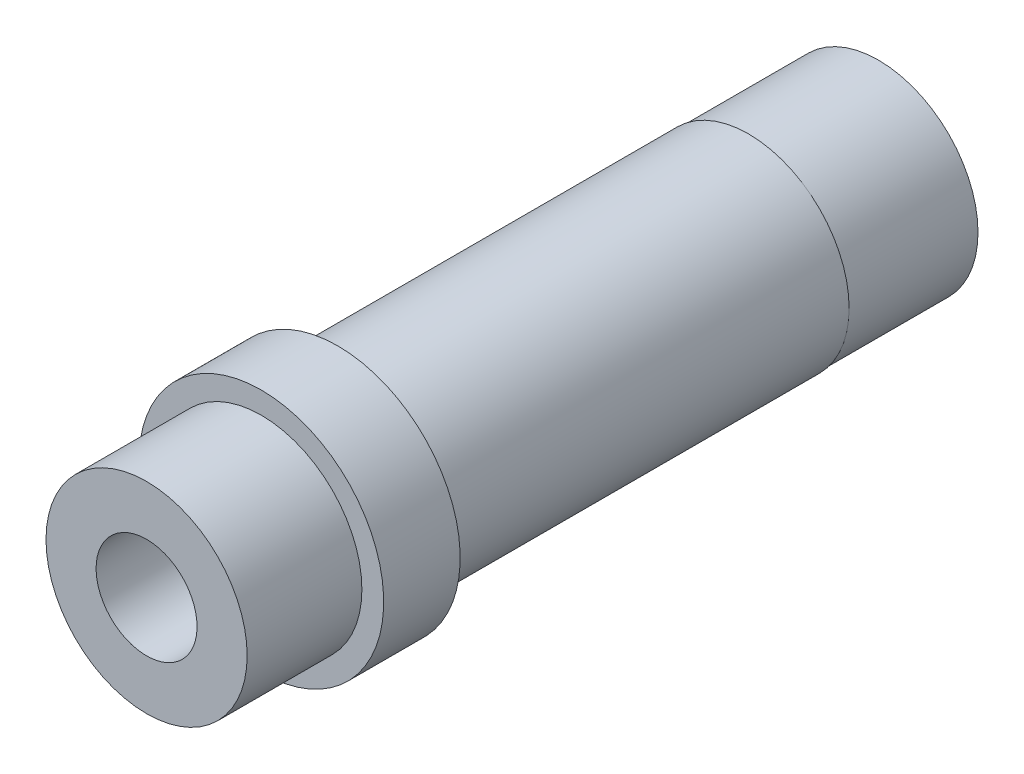
ISO-10303-21;
HEADER;
FILE_DESCRIPTION(('STEP AP214'),'2;1');
FILE_NAME('part.step','',(''),(''),'','','');
FILE_SCHEMA(('AUTOMOTIVE_DESIGN { 1 0 10303 214 1 1 1 1 }'));
ENDSEC;
DATA;
#1=APPLICATION_CONTEXT('core data for automotive mechanical design processes');
#2=APPLICATION_PROTOCOL_DEFINITION('international standard','automotive_design',2000,#1);
#3=PRODUCT_CONTEXT('',#1,'mechanical');
#4=PRODUCT('Part','Part','',(#3));
#5=PRODUCT_RELATED_PRODUCT_CATEGORY('part','',(#4));
#6=PRODUCT_DEFINITION_FORMATION('','',#4);
#7=PRODUCT_DEFINITION_CONTEXT('part definition',#1,'design');
#8=PRODUCT_DEFINITION('design','',#6,#7);
#9=PRODUCT_DEFINITION_SHAPE('','',#8);
#10=(LENGTH_UNIT() NAMED_UNIT(*) SI_UNIT(.MILLI.,.METRE.));
#11=(NAMED_UNIT(*) PLANE_ANGLE_UNIT() SI_UNIT($,.RADIAN.));
#12=(NAMED_UNIT(*) SI_UNIT($,.STERADIAN.) SOLID_ANGLE_UNIT());
#13=UNCERTAINTY_MEASURE_WITH_UNIT(LENGTH_MEASURE(1.E-05),#10,'distance_accuracy_value','');
#14=(GEOMETRIC_REPRESENTATION_CONTEXT(3) GLOBAL_UNCERTAINTY_ASSIGNED_CONTEXT((#13)) GLOBAL_UNIT_ASSIGNED_CONTEXT((#10,
#11,#12)) REPRESENTATION_CONTEXT('',''));
#15=CARTESIAN_POINT('',(0.,0.,0.));
#16=DIRECTION('',(0.,0.,1.));
#17=DIRECTION('',(1.,0.,0.));
#18=AXIS2_PLACEMENT_3D('',#15,#16,#17);
#19=CARTESIAN_POINT('',(0.,160.,0.));
#20=DIRECTION('',(0.,0.,-1.));
#21=DIRECTION('',(0.,1.,0.));
#22=AXIS2_PLACEMENT_3D('',#19,#20,#21);
#23=PLANE('',#22);
#24=CARTESIAN_POINT('',(0.,0.,0.));
#25=DIRECTION('',(0.,0.,1.));
#26=DIRECTION('',(0.,-1.,0.));
#27=AXIS2_PLACEMENT_3D('',#24,#25,#26);
#28=CIRCLE('',#27,131.5);
#29=CARTESIAN_POINT('',(0.,-131.5,0.));
#30=VERTEX_POINT('',#29);
#31=EDGE_CURVE('E72',#30,#30,#28,.T.);
#32=ORIENTED_EDGE('',*,*,#31,.F.);
#33=EDGE_LOOP('',(#32));
#34=FACE_BOUND('',#33,.T.);
#35=CARTESIAN_POINT('',(0.,0.,0.));
#36=DIRECTION('',(0.,0.,1.));
#37=DIRECTION('',(0.,-1.,0.));
#38=AXIS2_PLACEMENT_3D('',#35,#36,#37);
#39=CIRCLE('',#38,160.);
#40=CARTESIAN_POINT('',(0.,-160.,0.));
#41=VERTEX_POINT('',#40);
#42=EDGE_CURVE('E11',#41,#41,#39,.T.);
#43=ORIENTED_EDGE('',*,*,#42,.T.);
#44=EDGE_LOOP('',(#43));
#45=FACE_BOUND('',#44,.T.);
#46=ADVANCED_FACE('F43',(#34,#45),#23,.F.);
#47=CARTESIAN_POINT('',(0.,0.,150.));
#48=DIRECTION('',(0.,0.,1.));
#49=DIRECTION('',(0.,-1.,0.));
#50=AXIS2_PLACEMENT_3D('',#47,#48,#49);
#51=CYLINDRICAL_SURFACE('',#50,160.);
#52=ORIENTED_EDGE('',*,*,#42,.F.);
#53=EDGE_LOOP('',(#52));
#54=FACE_BOUND('',#53,.T.);
#55=CARTESIAN_POINT('',(0.,0.,-100.));
#56=DIRECTION('',(0.,0.,1.));
#57=DIRECTION('',(0.,-1.,0.));
#58=AXIS2_PLACEMENT_3D('',#55,#56,#57);
#59=CIRCLE('',#58,160.);
#60=CARTESIAN_POINT('',(0.,-160.,-100.));
#61=VERTEX_POINT('',#60);
#62=EDGE_CURVE('E49',#61,#61,#59,.T.);
#63=ORIENTED_EDGE('',*,*,#62,.T.);
#64=EDGE_LOOP('',(#63));
#65=FACE_BOUND('',#64,.T.);
#66=ADVANCED_FACE('F111',(#54,#65),#51,.T.);
#67=CARTESIAN_POINT('',(0.,160.,-100.));
#68=DIRECTION('',(0.,0.,1.));
#69=DIRECTION('',(0.,-1.,0.));
#70=AXIS2_PLACEMENT_3D('',#67,#68,#69);
#71=PLANE('',#70);
#72=ORIENTED_EDGE('',*,*,#62,.F.);
#73=EDGE_LOOP('',(#72));
#74=FACE_BOUND('',#73,.T.);
#75=CARTESIAN_POINT('',(0.,0.,-100.));
#76=DIRECTION('',(0.,0.,1.));
#77=DIRECTION('',(0.,-1.,0.));
#78=AXIS2_PLACEMENT_3D('',#75,#76,#77);
#79=CIRCLE('',#78,131.5);
#80=CARTESIAN_POINT('',(0.,-131.5,-100.));
#81=VERTEX_POINT('',#80);
#82=EDGE_CURVE('E53',#81,#81,#79,.T.);
#83=ORIENTED_EDGE('',*,*,#82,.T.);
#84=EDGE_LOOP('',(#83));
#85=FACE_BOUND('',#84,.T.);
#86=ADVANCED_FACE('F116',(#74,#85),#71,.F.);
#87=CARTESIAN_POINT('',(0.,0.,150.));
#88=DIRECTION('',(0.,0.,1.));
#89=DIRECTION('',(0.,-1.,0.));
#90=AXIS2_PLACEMENT_3D('',#87,#88,#89);
#91=CYLINDRICAL_SURFACE('',#90,131.5);
#92=ORIENTED_EDGE('',*,*,#82,.F.);
#93=EDGE_LOOP('',(#92));
#94=FACE_BOUND('',#93,.T.);
#95=CARTESIAN_POINT('',(0.,0.,-637.));
#96=DIRECTION('',(0.,0.,1.));
#97=DIRECTION('',(0.,-1.,0.));
#98=AXIS2_PLACEMENT_3D('',#95,#96,#97);
#99=CIRCLE('',#98,131.5);
#100=CARTESIAN_POINT('',(0.,-131.5,-637.));
#101=VERTEX_POINT('',#100);
#102=EDGE_CURVE('E57',#101,#101,#99,.T.);
#103=ORIENTED_EDGE('',*,*,#102,.T.);
#104=EDGE_LOOP('',(#103));
#105=FACE_BOUND('',#104,.T.);
#106=ADVANCED_FACE('F106',(#94,#105),#91,.T.);
#107=CARTESIAN_POINT('',(0.,131.5,-637.));
#108=DIRECTION('',(0.,0.,1.));
#109=DIRECTION('',(0.,-1.,0.));
#110=AXIS2_PLACEMENT_3D('',#107,#108,#109);
#111=PLANE('',#110);
#112=ORIENTED_EDGE('',*,*,#102,.F.);
#113=EDGE_LOOP('',(#112));
#114=FACE_BOUND('',#113,.T.);
#115=CARTESIAN_POINT('',(0.,0.,-637.));
#116=DIRECTION('',(0.,0.,1.));
#117=DIRECTION('',(0.,-1.,0.));
#118=AXIS2_PLACEMENT_3D('',#115,#116,#117);
#119=CIRCLE('',#118,130.);
#120=CARTESIAN_POINT('',(0.,-130.,-637.));
#121=VERTEX_POINT('',#120);
#122=EDGE_CURVE('E63',#121,#121,#119,.T.);
#123=ORIENTED_EDGE('',*,*,#122,.T.);
#124=EDGE_LOOP('',(#123));
#125=FACE_BOUND('',#124,.T.);
#126=ADVANCED_FACE('F100',(#114,#125),#111,.F.);
#127=CARTESIAN_POINT('',(0.,0.,150.));
#128=DIRECTION('',(0.,0.,1.));
#129=DIRECTION('',(0.,-1.,0.));
#130=AXIS2_PLACEMENT_3D('',#127,#128,#129);
#131=CYLINDRICAL_SURFACE('',#130,130.);
#132=ORIENTED_EDGE('',*,*,#122,.F.);
#133=EDGE_LOOP('',(#132));
#134=FACE_BOUND('',#133,.T.);
#135=CARTESIAN_POINT('',(0.,1.21134305049041E-13,-807.));
#136=DIRECTION('',(0.,0.,1.));
#137=DIRECTION('',(0.,-1.,0.));
#138=AXIS2_PLACEMENT_3D('',#135,#136,#137);
#139=CIRCLE('',#138,130.);
#140=CARTESIAN_POINT('',(0.,-130.,-807.));
#141=VERTEX_POINT('',#140);
#142=EDGE_CURVE('E66',#141,#141,#139,.T.);
#143=ORIENTED_EDGE('',*,*,#142,.T.);
#144=EDGE_LOOP('',(#143));
#145=FACE_BOUND('',#144,.T.);
#146=ADVANCED_FACE('F95',(#134,#145),#131,.T.);
#147=CARTESIAN_POINT('',(0.,130.,-807.));
#148=DIRECTION('',(0.,0.,1.));
#149=DIRECTION('',(0.,-1.,0.));
#150=AXIS2_PLACEMENT_3D('',#147,#148,#149);
#151=PLANE('',#150);
#152=CARTESIAN_POINT('',(0.,1.02147736859537E-13,-807.));
#153=DIRECTION('',(0.,0.,-1.));
#154=DIRECTION('',(0.,1.,0.));
#155=AXIS2_PLACEMENT_3D('',#152,#153,#154);
#156=CIRCLE('',#155,66.);
#157=CARTESIAN_POINT('',(0.,66.0000000000001,-807.));
#158=VERTEX_POINT('',#157);
#159=EDGE_CURVE('E76',#158,#158,#156,.T.);
#160=ORIENTED_EDGE('',*,*,#159,.F.);
#161=EDGE_LOOP('',(#160));
#162=FACE_BOUND('',#161,.T.);
#163=ORIENTED_EDGE('',*,*,#142,.F.);
#164=EDGE_LOOP('',(#163));
#165=FACE_BOUND('',#164,.T.);
#166=ADVANCED_FACE('F92',(#162,#165),#151,.F.);
#167=CARTESIAN_POINT('',(0.,131.5,150.));
#168=DIRECTION('',(0.,0.,-1.));
#169=DIRECTION('',(0.,1.,0.));
#170=AXIS2_PLACEMENT_3D('',#167,#168,#169);
#171=PLANE('',#170);
#172=CARTESIAN_POINT('',(0.,0.,150.));
#173=DIRECTION('',(0.,0.,-1.));
#174=DIRECTION('',(0.,1.,0.));
#175=AXIS2_PLACEMENT_3D('',#172,#173,#174);
#176=CIRCLE('',#175,66.);
#177=CARTESIAN_POINT('',(0.,66.,150.));
#178=VERTEX_POINT('',#177);
#179=EDGE_CURVE('E75',#178,#178,#176,.T.);
#180=ORIENTED_EDGE('',*,*,#179,.T.);
#181=EDGE_LOOP('',(#180));
#182=FACE_BOUND('',#181,.T.);
#183=CARTESIAN_POINT('',(0.,0.,150.));
#184=DIRECTION('',(0.,0.,1.));
#185=DIRECTION('',(0.,-1.,0.));
#186=AXIS2_PLACEMENT_3D('',#183,#184,#185);
#187=CIRCLE('',#186,131.5);
#188=CARTESIAN_POINT('',(0.,-131.5,150.));
#189=VERTEX_POINT('',#188);
#190=EDGE_CURVE('E69',#189,#189,#187,.T.);
#191=ORIENTED_EDGE('',*,*,#190,.T.);
#192=EDGE_LOOP('',(#191));
#193=FACE_BOUND('',#192,.T.);
#194=ADVANCED_FACE('F82',(#182,#193),#171,.F.);
#195=CARTESIAN_POINT('',(0.,0.,150.));
#196=DIRECTION('',(0.,0.,1.));
#197=DIRECTION('',(0.,-1.,0.));
#198=AXIS2_PLACEMENT_3D('',#195,#196,#197);
#199=CYLINDRICAL_SURFACE('',#198,131.5);
#200=ORIENTED_EDGE('',*,*,#190,.F.);
#201=EDGE_LOOP('',(#200));
#202=FACE_BOUND('',#201,.T.);
#203=ORIENTED_EDGE('',*,*,#31,.T.);
#204=EDGE_LOOP('',(#203));
#205=FACE_BOUND('',#204,.T.);
#206=ADVANCED_FACE('F88',(#202,#205),#199,.T.);
#207=CARTESIAN_POINT('',(0.,0.,150.));
#208=DIRECTION('',(0.,0.,-1.));
#209=DIRECTION('',(0.,1.,0.));
#210=AXIS2_PLACEMENT_3D('',#207,#208,#209);
#211=CYLINDRICAL_SURFACE('',#210,66.);
#212=CARTESIAN_POINT('',(0.,66.,150.));
#213=CARTESIAN_POINT('',(0.,66.,140.03125));
#214=CARTESIAN_POINT('',(0.,66.,130.0625));
#215=CARTESIAN_POINT('',(0.,66.,110.125));
#216=CARTESIAN_POINT('',(0.,66.,100.15625));
#217=CARTESIAN_POINT('',(0.,66.,80.2187499999999));
#218=CARTESIAN_POINT('',(0.,66.,70.2499999999999));
#219=CARTESIAN_POINT('',(0.,66.,50.3124999999999));
#220=CARTESIAN_POINT('',(0.,66.,40.3437499999999));
#221=CARTESIAN_POINT('',(0.,66.,20.4062499999999));
#222=CARTESIAN_POINT('',(0.,66.,10.4375));
#223=CARTESIAN_POINT('',(0.,66.,-9.50000000000005));
#224=CARTESIAN_POINT('',(0.,66.,-19.4687500000001));
#225=CARTESIAN_POINT('',(0.,66.,-39.4062500000001));
#226=CARTESIAN_POINT('',(0.,66.,-49.3750000000001));
#227=CARTESIAN_POINT('',(0.,66.,-69.3125000000001));
#228=CARTESIAN_POINT('',(0.,66.,-79.2812500000001));
#229=CARTESIAN_POINT('',(0.,66.,-99.2187500000001));
#230=CARTESIAN_POINT('',(0.,66.,-109.1875));
#231=CARTESIAN_POINT('',(0.,66.,-129.125));
#232=CARTESIAN_POINT('',(0.,66.,-139.09375));
#233=CARTESIAN_POINT('',(0.,66.,-159.03125));
#234=CARTESIAN_POINT('',(0.,66.,-169.));
#235=CARTESIAN_POINT('',(0.,66.,-188.9375));
#236=CARTESIAN_POINT('',(0.,66.,-198.90625));
#237=CARTESIAN_POINT('',(0.,66.,-218.84375));
#238=CARTESIAN_POINT('',(0.,66.,-228.8125));
#239=CARTESIAN_POINT('',(0.,66.,-248.75));
#240=CARTESIAN_POINT('',(0.,66.,-258.71875));
#241=CARTESIAN_POINT('',(0.,66.,-278.65625));
#242=CARTESIAN_POINT('',(0.,66.0000000000001,-288.625));
#243=CARTESIAN_POINT('',(0.,66.0000000000001,-308.5625));
#244=CARTESIAN_POINT('',(0.,66.0000000000001,-318.53125));
#245=CARTESIAN_POINT('',(0.,66.0000000000001,-338.46875));
#246=CARTESIAN_POINT('',(0.,66.0000000000001,-348.4375));
#247=CARTESIAN_POINT('',(0.,66.0000000000001,-368.375));
#248=CARTESIAN_POINT('',(0.,66.0000000000001,-378.34375));
#249=CARTESIAN_POINT('',(0.,66.0000000000001,-398.28125));
#250=CARTESIAN_POINT('',(0.,66.0000000000001,-408.25));
#251=CARTESIAN_POINT('',(0.,66.0000000000001,-428.1875));
#252=CARTESIAN_POINT('',(0.,66.0000000000001,-438.15625));
#253=CARTESIAN_POINT('',(0.,66.0000000000001,-458.09375));
#254=CARTESIAN_POINT('',(0.,66.0000000000001,-468.0625));
#255=CARTESIAN_POINT('',(0.,66.0000000000001,-488.));
#256=CARTESIAN_POINT('',(0.,66.0000000000001,-497.96875));
#257=CARTESIAN_POINT('',(0.,66.0000000000001,-517.90625));
#258=CARTESIAN_POINT('',(0.,66.0000000000001,-527.875));
#259=CARTESIAN_POINT('',(0.,66.0000000000001,-547.8125));
#260=CARTESIAN_POINT('',(0.,66.0000000000001,-557.78125));
#261=CARTESIAN_POINT('',(0.,66.0000000000001,-577.71875));
#262=CARTESIAN_POINT('',(0.,66.0000000000001,-587.6875));
#263=CARTESIAN_POINT('',(0.,66.0000000000001,-607.625));
#264=CARTESIAN_POINT('',(0.,66.0000000000001,-617.59375));
#265=CARTESIAN_POINT('',(0.,66.0000000000001,-637.53125));
#266=CARTESIAN_POINT('',(0.,66.0000000000001,-647.5));
#267=CARTESIAN_POINT('',(0.,66.0000000000001,-667.4375));
#268=CARTESIAN_POINT('',(0.,66.0000000000001,-677.40625));
#269=CARTESIAN_POINT('',(0.,66.0000000000001,-697.34375));
#270=CARTESIAN_POINT('',(0.,66.0000000000001,-707.3125));
#271=CARTESIAN_POINT('',(0.,66.0000000000001,-727.25));
#272=CARTESIAN_POINT('',(0.,66.0000000000001,-737.21875));
#273=CARTESIAN_POINT('',(0.,66.0000000000001,-757.15625));
#274=CARTESIAN_POINT('',(0.,66.0000000000001,-767.125));
#275=CARTESIAN_POINT('',(0.,66.0000000000001,-787.0625));
#276=CARTESIAN_POINT('',(0.,66.0000000000001,-797.03125));
#277=CARTESIAN_POINT('',(0.,66.0000000000001,-807.));
#278=B_SPLINE_CURVE_WITH_KNOTS('',3,(#212,#213,#214,#215,#216,#217,#218,#219,#220,#221,#222,
#223,#224,#225,#226,#227,#228,#229,#230,#231,#232,#233,#234,#235,#236,#237,#238,#239,#240,#241,
#242,#243,#244,#245,#246,#247,#248,#249,#250,#251,#252,#253,#254,#255,#256,#257,#258,#259,#260,
#261,#262,#263,#264,#265,#266,#267,#268,#269,#270,#271,#272,#273,#274,#275,#276,#277),
.UNSPECIFIED.,.F.,.F.,(4,2,2,2,2,2,2,2,2,2,2,2,2,2,2,2,2,2,2,2,2,2,2,2,2,2,2,2,2,2,2,2,4),(0.,
29.90625,59.8125,89.71875,119.625,149.53125,179.4375,209.34375,239.25,269.15625,299.0625,
328.96875,358.875,388.78125,418.6875,448.59375,478.5,508.40625,538.3125,568.21875,598.125,
628.03125,657.9375,687.84375,717.75,747.65625,777.5625,807.46875,837.375,867.28125,897.1875,
927.09375,957.),.UNSPECIFIED.);
#279=EDGE_CURVE('BSEAM85',#178,#158,#278,.T.);
#280=ORIENTED_EDGE('',*,*,#179,.F.);
#281=ORIENTED_EDGE('',*,*,#159,.T.);
#282=ORIENTED_EDGE('',*,*,#279,.T.);
#283=ORIENTED_EDGE('',*,*,#279,.F.);
#284=EDGE_LOOP('',(#280,#282,#281,#283));
#285=FACE_BOUND('',#284,.T.);
#286=ADVANCED_FACE('F85',(#285),#211,.F.);
#287=CLOSED_SHELL('',(#46,#66,#86,#106,#126,#146,#166,#194,#206,#286));
#288=MANIFOLD_SOLID_BREP('B2',#287);
#289=ADVANCED_BREP_SHAPE_REPRESENTATION('',(#18,#288),#14);
#290=SHAPE_DEFINITION_REPRESENTATION(#9,#289);
ENDSEC;
END-ISO-10303-21;
